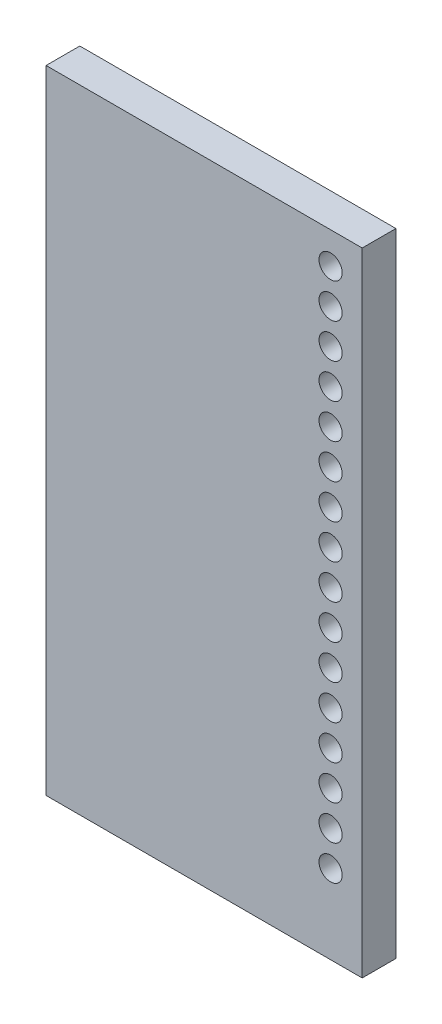
ISO-10303-21;
HEADER;
FILE_DESCRIPTION(('STEP AP214'),'2;1');
FILE_NAME('part.step','',(''),(''),'','','');
FILE_SCHEMA(('AUTOMOTIVE_DESIGN { 1 0 10303 214 1 1 1 1 }'));
ENDSEC;
DATA;
#1=APPLICATION_CONTEXT('core data for automotive mechanical design processes');
#2=APPLICATION_PROTOCOL_DEFINITION('international standard','automotive_design',2000,#1);
#3=PRODUCT_CONTEXT('',#1,'mechanical');
#4=PRODUCT('Part','Part','',(#3));
#5=PRODUCT_RELATED_PRODUCT_CATEGORY('part','',(#4));
#6=PRODUCT_DEFINITION_FORMATION('','',#4);
#7=PRODUCT_DEFINITION_CONTEXT('part definition',#1,'design');
#8=PRODUCT_DEFINITION('design','',#6,#7);
#9=PRODUCT_DEFINITION_SHAPE('','',#8);
#10=(LENGTH_UNIT() NAMED_UNIT(*) SI_UNIT(.MILLI.,.METRE.));
#11=(NAMED_UNIT(*) PLANE_ANGLE_UNIT() SI_UNIT($,.RADIAN.));
#12=(NAMED_UNIT(*) SI_UNIT($,.STERADIAN.) SOLID_ANGLE_UNIT());
#13=UNCERTAINTY_MEASURE_WITH_UNIT(LENGTH_MEASURE(1.E-05),#10,'distance_accuracy_value','');
#14=(GEOMETRIC_REPRESENTATION_CONTEXT(3) GLOBAL_UNCERTAINTY_ASSIGNED_CONTEXT((#13)) GLOBAL_UNIT_ASSIGNED_CONTEXT((#10,
#11,#12)) REPRESENTATION_CONTEXT('',''));
#15=CARTESIAN_POINT('',(0.,0.,0.));
#16=DIRECTION('',(0.,0.,1.));
#17=DIRECTION('',(1.,0.,0.));
#18=AXIS2_PLACEMENT_3D('',#15,#16,#17);
#19=CARTESIAN_POINT('',(60.,285.,0.));
#20=DIRECTION('',(0.,0.,1.));
#21=DIRECTION('',(1.,0.,0.));
#22=AXIS2_PLACEMENT_3D('',#19,#20,#21);
#23=CYLINDRICAL_SURFACE('',#22,5.5);
#24=CARTESIAN_POINT('',(60.,285.,0.));
#25=DIRECTION('',(0.,0.,1.));
#26=DIRECTION('',(1.,0.,0.));
#27=AXIS2_PLACEMENT_3D('',#24,#25,#26);
#28=CIRCLE('',#27,5.5);
#29=CARTESIAN_POINT('',(65.5,285.,0.));
#30=VERTEX_POINT('',#29);
#31=EDGE_CURVE('E60',#30,#30,#28,.T.);
#32=ORIENTED_EDGE('',*,*,#31,.F.);
#33=EDGE_LOOP('',(#32));
#34=FACE_BOUND('',#33,.T.);
#35=CARTESIAN_POINT('',(60.,285.,16.));
#36=DIRECTION('',(0.,0.,1.));
#37=DIRECTION('',(1.,0.,0.));
#38=AXIS2_PLACEMENT_3D('',#35,#36,#37);
#39=CIRCLE('',#38,5.5);
#40=CARTESIAN_POINT('',(65.5,285.,16.));
#41=VERTEX_POINT('',#40);
#42=EDGE_CURVE('E11',#41,#41,#39,.T.);
#43=ORIENTED_EDGE('',*,*,#42,.T.);
#44=EDGE_LOOP('',(#43));
#45=FACE_BOUND('',#44,.T.);
#46=ADVANCED_FACE('F51',(#34,#45),#23,.F.);
#47=CARTESIAN_POINT('',(60.,268.5,0.));
#48=DIRECTION('',(0.,0.,1.));
#49=DIRECTION('',(1.,0.,0.));
#50=AXIS2_PLACEMENT_3D('',#47,#48,#49);
#51=CYLINDRICAL_SURFACE('',#50,5.5);
#52=CARTESIAN_POINT('',(60.,268.5,0.));
#53=DIRECTION('',(0.,0.,1.));
#54=DIRECTION('',(1.,0.,0.));
#55=AXIS2_PLACEMENT_3D('',#52,#53,#54);
#56=CIRCLE('',#55,5.5);
#57=CARTESIAN_POINT('',(65.5,268.5,0.));
#58=VERTEX_POINT('',#57);
#59=EDGE_CURVE('E290',#58,#58,#56,.T.);
#60=ORIENTED_EDGE('',*,*,#59,.F.);
#61=EDGE_LOOP('',(#60));
#62=FACE_BOUND('',#61,.T.);
#63=CARTESIAN_POINT('',(60.,268.5,16.));
#64=DIRECTION('',(0.,0.,1.));
#65=DIRECTION('',(1.,0.,0.));
#66=AXIS2_PLACEMENT_3D('',#63,#64,#65);
#67=CIRCLE('',#66,5.5);
#68=CARTESIAN_POINT('',(65.5,268.5,16.));
#69=VERTEX_POINT('',#68);
#70=EDGE_CURVE('E294',#69,#69,#67,.T.);
#71=ORIENTED_EDGE('',*,*,#70,.T.);
#72=EDGE_LOOP('',(#71));
#73=FACE_BOUND('',#72,.T.);
#74=ADVANCED_FACE('F307',(#62,#73),#51,.F.);
#75=CARTESIAN_POINT('',(60.,252.,0.));
#76=DIRECTION('',(0.,0.,1.));
#77=DIRECTION('',(1.,0.,0.));
#78=AXIS2_PLACEMENT_3D('',#75,#76,#77);
#79=CYLINDRICAL_SURFACE('',#78,5.5);
#80=CARTESIAN_POINT('',(60.,252.,0.));
#81=DIRECTION('',(0.,0.,1.));
#82=DIRECTION('',(1.,0.,0.));
#83=AXIS2_PLACEMENT_3D('',#80,#81,#82);
#84=CIRCLE('',#83,5.5);
#85=CARTESIAN_POINT('',(65.5,252.,0.));
#86=VERTEX_POINT('',#85);
#87=EDGE_CURVE('E282',#86,#86,#84,.T.);
#88=ORIENTED_EDGE('',*,*,#87,.F.);
#89=EDGE_LOOP('',(#88));
#90=FACE_BOUND('',#89,.T.);
#91=CARTESIAN_POINT('',(60.,252.,16.));
#92=DIRECTION('',(0.,0.,1.));
#93=DIRECTION('',(1.,0.,0.));
#94=AXIS2_PLACEMENT_3D('',#91,#92,#93);
#95=CIRCLE('',#94,5.5);
#96=CARTESIAN_POINT('',(65.5,252.,16.));
#97=VERTEX_POINT('',#96);
#98=EDGE_CURVE('E286',#97,#97,#95,.T.);
#99=ORIENTED_EDGE('',*,*,#98,.T.);
#100=EDGE_LOOP('',(#99));
#101=FACE_BOUND('',#100,.T.);
#102=ADVANCED_FACE('F382',(#90,#101),#79,.F.);
#103=CARTESIAN_POINT('',(60.,235.5,0.));
#104=DIRECTION('',(0.,0.,1.));
#105=DIRECTION('',(1.,0.,0.));
#106=AXIS2_PLACEMENT_3D('',#103,#104,#105);
#107=CYLINDRICAL_SURFACE('',#106,5.5);
#108=CARTESIAN_POINT('',(60.,235.5,0.));
#109=DIRECTION('',(0.,0.,1.));
#110=DIRECTION('',(1.,0.,0.));
#111=AXIS2_PLACEMENT_3D('',#108,#109,#110);
#112=CIRCLE('',#111,5.5);
#113=CARTESIAN_POINT('',(65.5,235.5,0.));
#114=VERTEX_POINT('',#113);
#115=EDGE_CURVE('E274',#114,#114,#112,.T.);
#116=ORIENTED_EDGE('',*,*,#115,.F.);
#117=EDGE_LOOP('',(#116));
#118=FACE_BOUND('',#117,.T.);
#119=CARTESIAN_POINT('',(60.,235.5,16.));
#120=DIRECTION('',(0.,0.,1.));
#121=DIRECTION('',(1.,0.,0.));
#122=AXIS2_PLACEMENT_3D('',#119,#120,#121);
#123=CIRCLE('',#122,5.5);
#124=CARTESIAN_POINT('',(65.5,235.5,16.));
#125=VERTEX_POINT('',#124);
#126=EDGE_CURVE('E278',#125,#125,#123,.T.);
#127=ORIENTED_EDGE('',*,*,#126,.T.);
#128=EDGE_LOOP('',(#127));
#129=FACE_BOUND('',#128,.T.);
#130=ADVANCED_FACE('F378',(#118,#129),#107,.F.);
#131=CARTESIAN_POINT('',(60.,219.,0.));
#132=DIRECTION('',(0.,0.,1.));
#133=DIRECTION('',(1.,0.,0.));
#134=AXIS2_PLACEMENT_3D('',#131,#132,#133);
#135=CYLINDRICAL_SURFACE('',#134,5.5);
#136=CARTESIAN_POINT('',(60.,219.,0.));
#137=DIRECTION('',(0.,0.,1.));
#138=DIRECTION('',(1.,0.,0.));
#139=AXIS2_PLACEMENT_3D('',#136,#137,#138);
#140=CIRCLE('',#139,5.5);
#141=CARTESIAN_POINT('',(65.5,219.,0.));
#142=VERTEX_POINT('',#141);
#143=EDGE_CURVE('E266',#142,#142,#140,.T.);
#144=ORIENTED_EDGE('',*,*,#143,.F.);
#145=EDGE_LOOP('',(#144));
#146=FACE_BOUND('',#145,.T.);
#147=CARTESIAN_POINT('',(60.,219.,16.));
#148=DIRECTION('',(0.,0.,1.));
#149=DIRECTION('',(1.,0.,0.));
#150=AXIS2_PLACEMENT_3D('',#147,#148,#149);
#151=CIRCLE('',#150,5.5);
#152=CARTESIAN_POINT('',(65.5,219.,16.));
#153=VERTEX_POINT('',#152);
#154=EDGE_CURVE('E270',#153,#153,#151,.T.);
#155=ORIENTED_EDGE('',*,*,#154,.T.);
#156=EDGE_LOOP('',(#155));
#157=FACE_BOUND('',#156,.T.);
#158=ADVANCED_FACE('F374',(#146,#157),#135,.F.);
#159=CARTESIAN_POINT('',(60.,202.5,0.));
#160=DIRECTION('',(0.,0.,1.));
#161=DIRECTION('',(1.,0.,0.));
#162=AXIS2_PLACEMENT_3D('',#159,#160,#161);
#163=CYLINDRICAL_SURFACE('',#162,5.5);
#164=CARTESIAN_POINT('',(60.,202.5,0.));
#165=DIRECTION('',(0.,0.,1.));
#166=DIRECTION('',(1.,0.,0.));
#167=AXIS2_PLACEMENT_3D('',#164,#165,#166);
#168=CIRCLE('',#167,5.5);
#169=CARTESIAN_POINT('',(65.5,202.5,0.));
#170=VERTEX_POINT('',#169);
#171=EDGE_CURVE('E258',#170,#170,#168,.T.);
#172=ORIENTED_EDGE('',*,*,#171,.F.);
#173=EDGE_LOOP('',(#172));
#174=FACE_BOUND('',#173,.T.);
#175=CARTESIAN_POINT('',(60.,202.5,16.));
#176=DIRECTION('',(0.,0.,1.));
#177=DIRECTION('',(1.,0.,0.));
#178=AXIS2_PLACEMENT_3D('',#175,#176,#177);
#179=CIRCLE('',#178,5.5);
#180=CARTESIAN_POINT('',(65.5,202.5,16.));
#181=VERTEX_POINT('',#180);
#182=EDGE_CURVE('E262',#181,#181,#179,.T.);
#183=ORIENTED_EDGE('',*,*,#182,.T.);
#184=EDGE_LOOP('',(#183));
#185=FACE_BOUND('',#184,.T.);
#186=ADVANCED_FACE('F370',(#174,#185),#163,.F.);
#187=CARTESIAN_POINT('',(60.,186.,0.));
#188=DIRECTION('',(0.,0.,1.));
#189=DIRECTION('',(1.,0.,0.));
#190=AXIS2_PLACEMENT_3D('',#187,#188,#189);
#191=CYLINDRICAL_SURFACE('',#190,5.5);
#192=CARTESIAN_POINT('',(60.,186.,0.));
#193=DIRECTION('',(0.,0.,1.));
#194=DIRECTION('',(1.,0.,0.));
#195=AXIS2_PLACEMENT_3D('',#192,#193,#194);
#196=CIRCLE('',#195,5.5);
#197=CARTESIAN_POINT('',(65.5,186.,0.));
#198=VERTEX_POINT('',#197);
#199=EDGE_CURVE('E250',#198,#198,#196,.T.);
#200=ORIENTED_EDGE('',*,*,#199,.F.);
#201=EDGE_LOOP('',(#200));
#202=FACE_BOUND('',#201,.T.);
#203=CARTESIAN_POINT('',(60.,186.,16.));
#204=DIRECTION('',(0.,0.,1.));
#205=DIRECTION('',(1.,0.,0.));
#206=AXIS2_PLACEMENT_3D('',#203,#204,#205);
#207=CIRCLE('',#206,5.5);
#208=CARTESIAN_POINT('',(65.5,186.,16.));
#209=VERTEX_POINT('',#208);
#210=EDGE_CURVE('E254',#209,#209,#207,.T.);
#211=ORIENTED_EDGE('',*,*,#210,.T.);
#212=EDGE_LOOP('',(#211));
#213=FACE_BOUND('',#212,.T.);
#214=ADVANCED_FACE('F366',(#202,#213),#191,.F.);
#215=CARTESIAN_POINT('',(60.,169.5,0.));
#216=DIRECTION('',(0.,0.,1.));
#217=DIRECTION('',(1.,0.,0.));
#218=AXIS2_PLACEMENT_3D('',#215,#216,#217);
#219=CYLINDRICAL_SURFACE('',#218,5.5);
#220=CARTESIAN_POINT('',(60.,169.5,0.));
#221=DIRECTION('',(0.,0.,1.));
#222=DIRECTION('',(1.,0.,0.));
#223=AXIS2_PLACEMENT_3D('',#220,#221,#222);
#224=CIRCLE('',#223,5.5);
#225=CARTESIAN_POINT('',(65.5,169.5,0.));
#226=VERTEX_POINT('',#225);
#227=EDGE_CURVE('E242',#226,#226,#224,.T.);
#228=ORIENTED_EDGE('',*,*,#227,.F.);
#229=EDGE_LOOP('',(#228));
#230=FACE_BOUND('',#229,.T.);
#231=CARTESIAN_POINT('',(60.,169.5,16.));
#232=DIRECTION('',(0.,0.,1.));
#233=DIRECTION('',(1.,0.,0.));
#234=AXIS2_PLACEMENT_3D('',#231,#232,#233);
#235=CIRCLE('',#234,5.5);
#236=CARTESIAN_POINT('',(65.5,169.5,16.));
#237=VERTEX_POINT('',#236);
#238=EDGE_CURVE('E246',#237,#237,#235,.T.);
#239=ORIENTED_EDGE('',*,*,#238,.T.);
#240=EDGE_LOOP('',(#239));
#241=FACE_BOUND('',#240,.T.);
#242=ADVANCED_FACE('F362',(#230,#241),#219,.F.);
#243=CARTESIAN_POINT('',(60.,153.,0.));
#244=DIRECTION('',(0.,0.,1.));
#245=DIRECTION('',(1.,0.,0.));
#246=AXIS2_PLACEMENT_3D('',#243,#244,#245);
#247=CYLINDRICAL_SURFACE('',#246,5.5);
#248=CARTESIAN_POINT('',(60.,153.,0.));
#249=DIRECTION('',(0.,0.,1.));
#250=DIRECTION('',(1.,0.,0.));
#251=AXIS2_PLACEMENT_3D('',#248,#249,#250);
#252=CIRCLE('',#251,5.5);
#253=CARTESIAN_POINT('',(65.5,153.,0.));
#254=VERTEX_POINT('',#253);
#255=EDGE_CURVE('E234',#254,#254,#252,.T.);
#256=ORIENTED_EDGE('',*,*,#255,.F.);
#257=EDGE_LOOP('',(#256));
#258=FACE_BOUND('',#257,.T.);
#259=CARTESIAN_POINT('',(60.,153.,16.));
#260=DIRECTION('',(0.,0.,1.));
#261=DIRECTION('',(1.,0.,0.));
#262=AXIS2_PLACEMENT_3D('',#259,#260,#261);
#263=CIRCLE('',#262,5.5);
#264=CARTESIAN_POINT('',(65.5,153.,16.));
#265=VERTEX_POINT('',#264);
#266=EDGE_CURVE('E238',#265,#265,#263,.T.);
#267=ORIENTED_EDGE('',*,*,#266,.T.);
#268=EDGE_LOOP('',(#267));
#269=FACE_BOUND('',#268,.T.);
#270=ADVANCED_FACE('F358',(#258,#269),#247,.F.);
#271=CARTESIAN_POINT('',(60.,136.5,0.));
#272=DIRECTION('',(0.,0.,1.));
#273=DIRECTION('',(1.,0.,0.));
#274=AXIS2_PLACEMENT_3D('',#271,#272,#273);
#275=CYLINDRICAL_SURFACE('',#274,5.5);
#276=CARTESIAN_POINT('',(60.,136.5,0.));
#277=DIRECTION('',(0.,0.,1.));
#278=DIRECTION('',(1.,0.,0.));
#279=AXIS2_PLACEMENT_3D('',#276,#277,#278);
#280=CIRCLE('',#279,5.5);
#281=CARTESIAN_POINT('',(65.5,136.5,0.));
#282=VERTEX_POINT('',#281);
#283=EDGE_CURVE('E226',#282,#282,#280,.T.);
#284=ORIENTED_EDGE('',*,*,#283,.F.);
#285=EDGE_LOOP('',(#284));
#286=FACE_BOUND('',#285,.T.);
#287=CARTESIAN_POINT('',(60.,136.5,16.));
#288=DIRECTION('',(0.,0.,1.));
#289=DIRECTION('',(1.,0.,0.));
#290=AXIS2_PLACEMENT_3D('',#287,#288,#289);
#291=CIRCLE('',#290,5.5);
#292=CARTESIAN_POINT('',(65.5,136.5,16.));
#293=VERTEX_POINT('',#292);
#294=EDGE_CURVE('E230',#293,#293,#291,.T.);
#295=ORIENTED_EDGE('',*,*,#294,.T.);
#296=EDGE_LOOP('',(#295));
#297=FACE_BOUND('',#296,.T.);
#298=ADVANCED_FACE('F354',(#286,#297),#275,.F.);
#299=CARTESIAN_POINT('',(60.,120.,0.));
#300=DIRECTION('',(0.,0.,1.));
#301=DIRECTION('',(1.,0.,0.));
#302=AXIS2_PLACEMENT_3D('',#299,#300,#301);
#303=CYLINDRICAL_SURFACE('',#302,5.5);
#304=CARTESIAN_POINT('',(60.,120.,0.));
#305=DIRECTION('',(0.,0.,1.));
#306=DIRECTION('',(1.,0.,0.));
#307=AXIS2_PLACEMENT_3D('',#304,#305,#306);
#308=CIRCLE('',#307,5.5);
#309=CARTESIAN_POINT('',(65.5,120.,0.));
#310=VERTEX_POINT('',#309);
#311=EDGE_CURVE('E218',#310,#310,#308,.T.);
#312=ORIENTED_EDGE('',*,*,#311,.F.);
#313=EDGE_LOOP('',(#312));
#314=FACE_BOUND('',#313,.T.);
#315=CARTESIAN_POINT('',(60.,120.,16.));
#316=DIRECTION('',(0.,0.,1.));
#317=DIRECTION('',(1.,0.,0.));
#318=AXIS2_PLACEMENT_3D('',#315,#316,#317);
#319=CIRCLE('',#318,5.5);
#320=CARTESIAN_POINT('',(65.5,120.,16.));
#321=VERTEX_POINT('',#320);
#322=EDGE_CURVE('E222',#321,#321,#319,.T.);
#323=ORIENTED_EDGE('',*,*,#322,.T.);
#324=EDGE_LOOP('',(#323));
#325=FACE_BOUND('',#324,.T.);
#326=ADVANCED_FACE('F350',(#314,#325),#303,.F.);
#327=CARTESIAN_POINT('',(60.,103.5,0.));
#328=DIRECTION('',(0.,0.,1.));
#329=DIRECTION('',(1.,0.,0.));
#330=AXIS2_PLACEMENT_3D('',#327,#328,#329);
#331=CYLINDRICAL_SURFACE('',#330,5.5);
#332=CARTESIAN_POINT('',(60.,103.5,0.));
#333=DIRECTION('',(0.,0.,1.));
#334=DIRECTION('',(1.,0.,0.));
#335=AXIS2_PLACEMENT_3D('',#332,#333,#334);
#336=CIRCLE('',#335,5.5);
#337=CARTESIAN_POINT('',(65.5,103.5,0.));
#338=VERTEX_POINT('',#337);
#339=EDGE_CURVE('E210',#338,#338,#336,.T.);
#340=ORIENTED_EDGE('',*,*,#339,.F.);
#341=EDGE_LOOP('',(#340));
#342=FACE_BOUND('',#341,.T.);
#343=CARTESIAN_POINT('',(60.,103.5,16.));
#344=DIRECTION('',(0.,0.,1.));
#345=DIRECTION('',(1.,0.,0.));
#346=AXIS2_PLACEMENT_3D('',#343,#344,#345);
#347=CIRCLE('',#346,5.5);
#348=CARTESIAN_POINT('',(65.5,103.5,16.));
#349=VERTEX_POINT('',#348);
#350=EDGE_CURVE('E214',#349,#349,#347,.T.);
#351=ORIENTED_EDGE('',*,*,#350,.T.);
#352=EDGE_LOOP('',(#351));
#353=FACE_BOUND('',#352,.T.);
#354=ADVANCED_FACE('F346',(#342,#353),#331,.F.);
#355=CARTESIAN_POINT('',(60.,87.,0.));
#356=DIRECTION('',(0.,0.,1.));
#357=DIRECTION('',(1.,0.,0.));
#358=AXIS2_PLACEMENT_3D('',#355,#356,#357);
#359=CYLINDRICAL_SURFACE('',#358,5.5);
#360=CARTESIAN_POINT('',(60.,87.,0.));
#361=DIRECTION('',(0.,0.,1.));
#362=DIRECTION('',(1.,0.,0.));
#363=AXIS2_PLACEMENT_3D('',#360,#361,#362);
#364=CIRCLE('',#363,5.5);
#365=CARTESIAN_POINT('',(65.5,87.,0.));
#366=VERTEX_POINT('',#365);
#367=EDGE_CURVE('E202',#366,#366,#364,.T.);
#368=ORIENTED_EDGE('',*,*,#367,.F.);
#369=EDGE_LOOP('',(#368));
#370=FACE_BOUND('',#369,.T.);
#371=CARTESIAN_POINT('',(60.,87.,16.));
#372=DIRECTION('',(0.,0.,1.));
#373=DIRECTION('',(1.,0.,0.));
#374=AXIS2_PLACEMENT_3D('',#371,#372,#373);
#375=CIRCLE('',#374,5.5);
#376=CARTESIAN_POINT('',(65.5,87.,16.));
#377=VERTEX_POINT('',#376);
#378=EDGE_CURVE('E206',#377,#377,#375,.T.);
#379=ORIENTED_EDGE('',*,*,#378,.T.);
#380=EDGE_LOOP('',(#379));
#381=FACE_BOUND('',#380,.T.);
#382=ADVANCED_FACE('F342',(#370,#381),#359,.F.);
#383=CARTESIAN_POINT('',(60.,70.5,0.));
#384=DIRECTION('',(0.,0.,1.));
#385=DIRECTION('',(1.,0.,0.));
#386=AXIS2_PLACEMENT_3D('',#383,#384,#385);
#387=CYLINDRICAL_SURFACE('',#386,5.5);
#388=CARTESIAN_POINT('',(60.,70.5,0.));
#389=DIRECTION('',(0.,0.,1.));
#390=DIRECTION('',(1.,0.,0.));
#391=AXIS2_PLACEMENT_3D('',#388,#389,#390);
#392=CIRCLE('',#391,5.5);
#393=CARTESIAN_POINT('',(65.5,70.5,0.));
#394=VERTEX_POINT('',#393);
#395=EDGE_CURVE('E194',#394,#394,#392,.T.);
#396=ORIENTED_EDGE('',*,*,#395,.F.);
#397=EDGE_LOOP('',(#396));
#398=FACE_BOUND('',#397,.T.);
#399=CARTESIAN_POINT('',(60.,70.5,16.));
#400=DIRECTION('',(0.,0.,1.));
#401=DIRECTION('',(1.,0.,0.));
#402=AXIS2_PLACEMENT_3D('',#399,#400,#401);
#403=CIRCLE('',#402,5.5);
#404=CARTESIAN_POINT('',(65.5,70.5,16.));
#405=VERTEX_POINT('',#404);
#406=EDGE_CURVE('E198',#405,#405,#403,.T.);
#407=ORIENTED_EDGE('',*,*,#406,.T.);
#408=EDGE_LOOP('',(#407));
#409=FACE_BOUND('',#408,.T.);
#410=ADVANCED_FACE('F339',(#398,#409),#387,.F.);
#411=CARTESIAN_POINT('',(-75.,0.,16.));
#412=DIRECTION('',(1.,0.,0.));
#413=DIRECTION('',(0.,1.,0.));
#414=AXIS2_PLACEMENT_3D('',#411,#412,#413);
#415=PLANE('',#414);
#416=DIRECTION('',(0.,-1.,0.));
#417=VECTOR('',#416,1.);
#418=CARTESIAN_POINT('',(-75.,0.,0.));
#419=LINE('',#418,#417);
#420=CARTESIAN_POINT('',(-75.0000000000001,300.,0.));
#421=VERTEX_POINT('',#420);
#422=CARTESIAN_POINT('',(-75.,0.,0.));
#423=VERTEX_POINT('',#422);
#424=EDGE_CURVE('E158',#421,#423,#419,.T.);
#425=ORIENTED_EDGE('',*,*,#424,.T.);
#426=DIRECTION('',(0.,0.,-1.));
#427=VECTOR('',#426,1.);
#428=CARTESIAN_POINT('',(-75.,0.,16.));
#429=LINE('',#428,#427);
#430=CARTESIAN_POINT('',(-75.,0.,16.));
#431=VERTEX_POINT('',#430);
#432=EDGE_CURVE('E191',#431,#423,#429,.T.);
#433=ORIENTED_EDGE('',*,*,#432,.F.);
#434=DIRECTION('',(0.,-1.,0.));
#435=VECTOR('',#434,1.);
#436=CARTESIAN_POINT('',(-75.,0.,16.));
#437=LINE('',#436,#435);
#438=CARTESIAN_POINT('',(-75.0000000000001,300.,16.));
#439=VERTEX_POINT('',#438);
#440=EDGE_CURVE('E162',#439,#431,#437,.T.);
#441=ORIENTED_EDGE('',*,*,#440,.F.);
#442=DIRECTION('',(0.,0.,-1.));
#443=VECTOR('',#442,1.);
#444=CARTESIAN_POINT('',(-75.0000000000001,300.,16.));
#445=LINE('',#444,#443);
#446=EDGE_CURVE('E172',#439,#421,#445,.T.);
#447=ORIENTED_EDGE('',*,*,#446,.T.);
#448=EDGE_LOOP('',(#425,#433,#441,#447));
#449=FACE_BOUND('',#448,.T.);
#450=ADVANCED_FACE('F335',(#449),#415,.F.);
#451=CARTESIAN_POINT('',(-75.,0.,16.));
#452=DIRECTION('',(0.,1.,0.));
#453=DIRECTION('',(-1.,0.,0.));
#454=AXIS2_PLACEMENT_3D('',#451,#452,#453);
#455=PLANE('',#454);
#456=CARTESIAN_POINT('',(60.,0.,8.));
#457=DIRECTION('',(0.,-1.,0.));
#458=DIRECTION('',(0.,0.,-1.));
#459=AXIS2_PLACEMENT_3D('',#456,#457,#458);
#460=CIRCLE('',#459,1.7272);
#461=CARTESIAN_POINT('',(60.,0.,6.2728));
#462=VERTEX_POINT('',#461);
#463=EDGE_CURVE('E122',#462,#462,#460,.T.);
#464=ORIENTED_EDGE('',*,*,#463,.F.);
#465=EDGE_LOOP('',(#464));
#466=FACE_BOUND('',#465,.T.);
#467=CARTESIAN_POINT('',(0.,0.,8.));
#468=DIRECTION('',(0.,-1.,0.));
#469=DIRECTION('',(0.,0.,-1.));
#470=AXIS2_PLACEMENT_3D('',#467,#468,#469);
#471=CIRCLE('',#470,1.7272);
#472=CARTESIAN_POINT('',(0.,0.,6.2728));
#473=VERTEX_POINT('',#472);
#474=EDGE_CURVE('E121',#473,#473,#471,.T.);
#475=ORIENTED_EDGE('',*,*,#474,.F.);
#476=EDGE_LOOP('',(#475));
#477=FACE_BOUND('',#476,.T.);
#478=CARTESIAN_POINT('',(-60.,0.,8.));
#479=DIRECTION('',(0.,-1.,0.));
#480=DIRECTION('',(0.,0.,-1.));
#481=AXIS2_PLACEMENT_3D('',#478,#479,#480);
#482=CIRCLE('',#481,1.7272);
#483=CARTESIAN_POINT('',(-60.,0.,6.2728));
#484=VERTEX_POINT('',#483);
#485=EDGE_CURVE('E137',#484,#484,#482,.T.);
#486=ORIENTED_EDGE('',*,*,#485,.F.);
#487=EDGE_LOOP('',(#486));
#488=FACE_BOUND('',#487,.T.);
#489=DIRECTION('',(1.,0.,0.));
#490=VECTOR('',#489,1.);
#491=CARTESIAN_POINT('',(-75.,0.,0.));
#492=LINE('',#491,#490);
#493=CARTESIAN_POINT('',(75.,0.,0.));
#494=VERTEX_POINT('',#493);
#495=EDGE_CURVE('E176',#423,#494,#492,.T.);
#496=ORIENTED_EDGE('',*,*,#495,.T.);
#497=DIRECTION('',(0.,0.,-1.));
#498=VECTOR('',#497,1.);
#499=CARTESIAN_POINT('',(75.,0.,16.));
#500=LINE('',#499,#498);
#501=CARTESIAN_POINT('',(75.,0.,16.));
#502=VERTEX_POINT('',#501);
#503=EDGE_CURVE('E188',#502,#494,#500,.T.);
#504=ORIENTED_EDGE('',*,*,#503,.F.);
#505=DIRECTION('',(1.,0.,0.));
#506=VECTOR('',#505,1.);
#507=CARTESIAN_POINT('',(-75.,0.,16.));
#508=LINE('',#507,#506);
#509=EDGE_CURVE('E100',#431,#502,#508,.T.);
#510=ORIENTED_EDGE('',*,*,#509,.F.);
#511=ORIENTED_EDGE('',*,*,#432,.T.);
#512=EDGE_LOOP('',(#496,#504,#510,#511));
#513=FACE_BOUND('',#512,.T.);
#514=ADVANCED_FACE('F332',(#466,#477,#488,#513),#455,.F.);
#515=CARTESIAN_POINT('',(75.,0.,16.));
#516=DIRECTION('',(-1.,0.,0.));
#517=DIRECTION('',(0.,-1.,0.));
#518=AXIS2_PLACEMENT_3D('',#515,#516,#517);
#519=PLANE('',#518);
#520=DIRECTION('',(0.,1.,0.));
#521=VECTOR('',#520,1.);
#522=CARTESIAN_POINT('',(75.,0.,0.));
#523=LINE('',#522,#521);
#524=CARTESIAN_POINT('',(75.,300.,0.));
#525=VERTEX_POINT('',#524);
#526=EDGE_CURVE('E86',#494,#525,#523,.T.);
#527=ORIENTED_EDGE('',*,*,#526,.T.);
#528=DIRECTION('',(0.,0.,-1.));
#529=VECTOR('',#528,1.);
#530=CARTESIAN_POINT('',(75.,300.,16.));
#531=LINE('',#530,#529);
#532=CARTESIAN_POINT('',(75.,300.,16.));
#533=VERTEX_POINT('',#532);
#534=EDGE_CURVE('E185',#533,#525,#531,.T.);
#535=ORIENTED_EDGE('',*,*,#534,.F.);
#536=DIRECTION('',(0.,1.,0.));
#537=VECTOR('',#536,1.);
#538=CARTESIAN_POINT('',(75.,0.,16.));
#539=LINE('',#538,#537);
#540=EDGE_CURVE('E167',#502,#533,#539,.T.);
#541=ORIENTED_EDGE('',*,*,#540,.F.);
#542=ORIENTED_EDGE('',*,*,#503,.T.);
#543=EDGE_LOOP('',(#527,#535,#541,#542));
#544=FACE_BOUND('',#543,.T.);
#545=ADVANCED_FACE('F323',(#544),#519,.F.);
#546=CARTESIAN_POINT('',(-75.0000000000001,300.,16.));
#547=DIRECTION('',(0.,-1.,0.));
#548=DIRECTION('',(0.,0.,-1.));
#549=AXIS2_PLACEMENT_3D('',#546,#547,#548);
#550=PLANE('',#549);
#551=DIRECTION('',(-1.,0.,0.));
#552=VECTOR('',#551,1.);
#553=CARTESIAN_POINT('',(-75.0000000000001,300.,0.));
#554=LINE('',#553,#552);
#555=EDGE_CURVE('E92',#525,#421,#554,.T.);
#556=ORIENTED_EDGE('',*,*,#555,.T.);
#557=ORIENTED_EDGE('',*,*,#446,.F.);
#558=DIRECTION('',(-1.,0.,0.));
#559=VECTOR('',#558,1.);
#560=CARTESIAN_POINT('',(-75.0000000000001,300.,16.));
#561=LINE('',#560,#559);
#562=EDGE_CURVE('E68',#533,#439,#561,.T.);
#563=ORIENTED_EDGE('',*,*,#562,.F.);
#564=ORIENTED_EDGE('',*,*,#534,.T.);
#565=EDGE_LOOP('',(#556,#557,#563,#564));
#566=FACE_BOUND('',#565,.T.);
#567=ADVANCED_FACE('F312',(#566),#550,.F.);
#568=CARTESIAN_POINT('',(0.,0.,16.));
#569=DIRECTION('',(0.,0.,-1.));
#570=DIRECTION('',(-1.,0.,0.));
#571=AXIS2_PLACEMENT_3D('',#568,#569,#570);
#572=PLANE('',#571);
#573=CARTESIAN_POINT('',(60.,54.,16.));
#574=DIRECTION('',(0.,0.,1.));
#575=DIRECTION('',(1.,0.,0.));
#576=AXIS2_PLACEMENT_3D('',#573,#574,#575);
#577=CIRCLE('',#576,5.5);
#578=CARTESIAN_POINT('',(65.5,54.,16.));
#579=VERTEX_POINT('',#578);
#580=EDGE_CURVE('E149',#579,#579,#577,.T.);
#581=ORIENTED_EDGE('',*,*,#580,.F.);
#582=EDGE_LOOP('',(#581));
#583=FACE_BOUND('',#582,.T.);
#584=CARTESIAN_POINT('',(60.,37.5,16.));
#585=DIRECTION('',(0.,0.,1.));
#586=DIRECTION('',(1.,0.,0.));
#587=AXIS2_PLACEMENT_3D('',#584,#585,#586);
#588=CIRCLE('',#587,5.5);
#589=CARTESIAN_POINT('',(65.5,37.5,16.));
#590=VERTEX_POINT('',#589);
#591=EDGE_CURVE('E153',#590,#590,#588,.T.);
#592=ORIENTED_EDGE('',*,*,#591,.F.);
#593=EDGE_LOOP('',(#592));
#594=FACE_BOUND('',#593,.T.);
#595=ORIENTED_EDGE('',*,*,#440,.T.);
#596=ORIENTED_EDGE('',*,*,#509,.T.);
#597=ORIENTED_EDGE('',*,*,#540,.T.);
#598=ORIENTED_EDGE('',*,*,#562,.T.);
#599=EDGE_LOOP('',(#595,#596,#597,#598));
#600=FACE_BOUND('',#599,.T.);
#601=ORIENTED_EDGE('',*,*,#406,.F.);
#602=EDGE_LOOP('',(#601));
#603=FACE_BOUND('',#602,.T.);
#604=ORIENTED_EDGE('',*,*,#378,.F.);
#605=EDGE_LOOP('',(#604));
#606=FACE_BOUND('',#605,.T.);
#607=ORIENTED_EDGE('',*,*,#350,.F.);
#608=EDGE_LOOP('',(#607));
#609=FACE_BOUND('',#608,.T.);
#610=ORIENTED_EDGE('',*,*,#322,.F.);
#611=EDGE_LOOP('',(#610));
#612=FACE_BOUND('',#611,.T.);
#613=ORIENTED_EDGE('',*,*,#294,.F.);
#614=EDGE_LOOP('',(#613));
#615=FACE_BOUND('',#614,.T.);
#616=ORIENTED_EDGE('',*,*,#266,.F.);
#617=EDGE_LOOP('',(#616));
#618=FACE_BOUND('',#617,.T.);
#619=ORIENTED_EDGE('',*,*,#238,.F.);
#620=EDGE_LOOP('',(#619));
#621=FACE_BOUND('',#620,.T.);
#622=ORIENTED_EDGE('',*,*,#210,.F.);
#623=EDGE_LOOP('',(#622));
#624=FACE_BOUND('',#623,.T.);
#625=ORIENTED_EDGE('',*,*,#182,.F.);
#626=EDGE_LOOP('',(#625));
#627=FACE_BOUND('',#626,.T.);
#628=ORIENTED_EDGE('',*,*,#154,.F.);
#629=EDGE_LOOP('',(#628));
#630=FACE_BOUND('',#629,.T.);
#631=ORIENTED_EDGE('',*,*,#126,.F.);
#632=EDGE_LOOP('',(#631));
#633=FACE_BOUND('',#632,.T.);
#634=ORIENTED_EDGE('',*,*,#98,.F.);
#635=EDGE_LOOP('',(#634));
#636=FACE_BOUND('',#635,.T.);
#637=ORIENTED_EDGE('',*,*,#70,.F.);
#638=EDGE_LOOP('',(#637));
#639=FACE_BOUND('',#638,.T.);
#640=ORIENTED_EDGE('',*,*,#42,.F.);
#641=EDGE_LOOP('',(#640));
#642=FACE_BOUND('',#641,.T.);
#643=ADVANCED_FACE('F310',(#583,#594,#600,#603,#606,#609,#612,#615,#618,#621,#624,#627,#630,
#633,#636,#639,#642),#572,.F.);
#644=CARTESIAN_POINT('',(0.,0.,0.));
#645=DIRECTION('',(0.,0.,-1.));
#646=DIRECTION('',(-1.,0.,0.));
#647=AXIS2_PLACEMENT_3D('',#644,#645,#646);
#648=PLANE('',#647);
#649=CARTESIAN_POINT('',(60.,54.,0.));
#650=DIRECTION('',(0.,0.,1.));
#651=DIRECTION('',(1.,0.,0.));
#652=AXIS2_PLACEMENT_3D('',#649,#650,#651);
#653=CIRCLE('',#652,5.5);
#654=CARTESIAN_POINT('',(65.5,54.,0.));
#655=VERTEX_POINT('',#654);
#656=EDGE_CURVE('E145',#655,#655,#653,.T.);
#657=ORIENTED_EDGE('',*,*,#656,.T.);
#658=EDGE_LOOP('',(#657));
#659=FACE_BOUND('',#658,.T.);
#660=CARTESIAN_POINT('',(60.,37.5,0.));
#661=DIRECTION('',(0.,0.,1.));
#662=DIRECTION('',(1.,0.,0.));
#663=AXIS2_PLACEMENT_3D('',#660,#661,#662);
#664=CIRCLE('',#663,5.5);
#665=CARTESIAN_POINT('',(65.5,37.5,0.));
#666=VERTEX_POINT('',#665);
#667=EDGE_CURVE('E154',#666,#666,#664,.T.);
#668=ORIENTED_EDGE('',*,*,#667,.T.);
#669=EDGE_LOOP('',(#668));
#670=FACE_BOUND('',#669,.T.);
#671=ORIENTED_EDGE('',*,*,#424,.F.);
#672=ORIENTED_EDGE('',*,*,#555,.F.);
#673=ORIENTED_EDGE('',*,*,#526,.F.);
#674=ORIENTED_EDGE('',*,*,#495,.F.);
#675=EDGE_LOOP('',(#671,#672,#673,#674));
#676=FACE_BOUND('',#675,.T.);
#677=ORIENTED_EDGE('',*,*,#395,.T.);
#678=EDGE_LOOP('',(#677));
#679=FACE_BOUND('',#678,.T.);
#680=ORIENTED_EDGE('',*,*,#367,.T.);
#681=EDGE_LOOP('',(#680));
#682=FACE_BOUND('',#681,.T.);
#683=ORIENTED_EDGE('',*,*,#339,.T.);
#684=EDGE_LOOP('',(#683));
#685=FACE_BOUND('',#684,.T.);
#686=ORIENTED_EDGE('',*,*,#311,.T.);
#687=EDGE_LOOP('',(#686));
#688=FACE_BOUND('',#687,.T.);
#689=ORIENTED_EDGE('',*,*,#283,.T.);
#690=EDGE_LOOP('',(#689));
#691=FACE_BOUND('',#690,.T.);
#692=ORIENTED_EDGE('',*,*,#255,.T.);
#693=EDGE_LOOP('',(#692));
#694=FACE_BOUND('',#693,.T.);
#695=ORIENTED_EDGE('',*,*,#227,.T.);
#696=EDGE_LOOP('',(#695));
#697=FACE_BOUND('',#696,.T.);
#698=ORIENTED_EDGE('',*,*,#199,.T.);
#699=EDGE_LOOP('',(#698));
#700=FACE_BOUND('',#699,.T.);
#701=ORIENTED_EDGE('',*,*,#171,.T.);
#702=EDGE_LOOP('',(#701));
#703=FACE_BOUND('',#702,.T.);
#704=ORIENTED_EDGE('',*,*,#143,.T.);
#705=EDGE_LOOP('',(#704));
#706=FACE_BOUND('',#705,.T.);
#707=ORIENTED_EDGE('',*,*,#115,.T.);
#708=EDGE_LOOP('',(#707));
#709=FACE_BOUND('',#708,.T.);
#710=ORIENTED_EDGE('',*,*,#87,.T.);
#711=EDGE_LOOP('',(#710));
#712=FACE_BOUND('',#711,.T.);
#713=ORIENTED_EDGE('',*,*,#59,.T.);
#714=EDGE_LOOP('',(#713));
#715=FACE_BOUND('',#714,.T.);
#716=ORIENTED_EDGE('',*,*,#31,.T.);
#717=EDGE_LOOP('',(#716));
#718=FACE_BOUND('',#717,.T.);
#719=ADVANCED_FACE('F303',(#659,#670,#676,#679,#682,#685,#688,#691,#694,#697,#700,#703,#706,
#709,#712,#715,#718),#648,.T.);
#720=CARTESIAN_POINT('',(60.,37.5,0.));
#721=DIRECTION('',(0.,0.,1.));
#722=DIRECTION('',(1.,0.,0.));
#723=AXIS2_PLACEMENT_3D('',#720,#721,#722);
#724=CYLINDRICAL_SURFACE('',#723,5.5);
#725=ORIENTED_EDGE('',*,*,#667,.F.);
#726=EDGE_LOOP('',(#725));
#727=FACE_BOUND('',#726,.T.);
#728=ORIENTED_EDGE('',*,*,#591,.T.);
#729=EDGE_LOOP('',(#728));
#730=FACE_BOUND('',#729,.T.);
#731=ADVANCED_FACE('F319',(#727,#730),#724,.F.);
#732=CARTESIAN_POINT('',(60.,54.,0.));
#733=DIRECTION('',(0.,0.,1.));
#734=DIRECTION('',(1.,0.,0.));
#735=AXIS2_PLACEMENT_3D('',#732,#733,#734);
#736=CYLINDRICAL_SURFACE('',#735,5.5);
#737=ORIENTED_EDGE('',*,*,#656,.F.);
#738=EDGE_LOOP('',(#737));
#739=FACE_BOUND('',#738,.T.);
#740=ORIENTED_EDGE('',*,*,#580,.T.);
#741=EDGE_LOOP('',(#740));
#742=FACE_BOUND('',#741,.T.);
#743=ADVANCED_FACE('F464',(#739,#742),#736,.F.);
#744=CARTESIAN_POINT('',(-60.,25.,8.));
#745=DIRECTION('',(0.,-1.,0.));
#746=DIRECTION('',(0.,0.,-1.));
#747=AXIS2_PLACEMENT_3D('',#744,#745,#746);
#748=CONICAL_SURFACE('',#747,1.72719999999999,1.02974425867665);
#749=CARTESIAN_POINT('',(-60.,26.0378064611844,8.));
#750=VERTEX_POINT('',#749);
#751=VERTEX_LOOP('',#750);
#752=FACE_BOUND('',#751,.T.);
#753=CARTESIAN_POINT('',(-60.,25.,8.));
#754=DIRECTION('',(0.,-1.,0.));
#755=DIRECTION('',(0.,0.,-1.));
#756=AXIS2_PLACEMENT_3D('',#753,#754,#755);
#757=CIRCLE('',#756,1.72719999999999);
#758=CARTESIAN_POINT('',(-60.,25.,6.27280000000001));
#759=VERTEX_POINT('',#758);
#760=EDGE_CURVE('E141',#759,#759,#757,.T.);
#761=ORIENTED_EDGE('',*,*,#760,.T.);
#762=EDGE_LOOP('',(#761));
#763=FACE_BOUND('',#762,.T.);
#764=ADVANCED_FACE('F469',(#752,#763),#748,.F.);
#765=CARTESIAN_POINT('',(-60.,0.,8.));
#766=DIRECTION('',(0.,-1.,0.));
#767=DIRECTION('',(0.,0.,-1.));
#768=AXIS2_PLACEMENT_3D('',#765,#766,#767);
#769=CYLINDRICAL_SURFACE('',#768,1.72719999999999);
#770=ORIENTED_EDGE('',*,*,#760,.F.);
#771=EDGE_LOOP('',(#770));
#772=FACE_BOUND('',#771,.T.);
#773=ORIENTED_EDGE('',*,*,#485,.T.);
#774=EDGE_LOOP('',(#773));
#775=FACE_BOUND('',#774,.T.);
#776=ADVANCED_FACE('F480',(#772,#775),#769,.F.);
#777=CARTESIAN_POINT('',(0.,25.,8.));
#778=DIRECTION('',(0.,-1.,0.));
#779=DIRECTION('',(0.,0.,-1.));
#780=AXIS2_PLACEMENT_3D('',#777,#778,#779);
#781=CONICAL_SURFACE('',#780,1.72719999999999,1.02974425867665);
#782=CARTESIAN_POINT('',(0.,26.0378064611844,8.));
#783=VERTEX_POINT('',#782);
#784=VERTEX_LOOP('',#783);
#785=FACE_BOUND('',#784,.T.);
#786=CARTESIAN_POINT('',(0.,25.,8.));
#787=DIRECTION('',(0.,-1.,0.));
#788=DIRECTION('',(0.,0.,-1.));
#789=AXIS2_PLACEMENT_3D('',#786,#787,#788);
#790=CIRCLE('',#789,1.72719999999999);
#791=CARTESIAN_POINT('',(0.,25.,6.27280000000001));
#792=VERTEX_POINT('',#791);
#793=EDGE_CURVE('E129',#792,#792,#790,.T.);
#794=ORIENTED_EDGE('',*,*,#793,.T.);
#795=EDGE_LOOP('',(#794));
#796=FACE_BOUND('',#795,.T.);
#797=ADVANCED_FACE('F492',(#785,#796),#781,.F.);
#798=CARTESIAN_POINT('',(0.,0.,8.));
#799=DIRECTION('',(0.,-1.,0.));
#800=DIRECTION('',(0.,0.,-1.));
#801=AXIS2_PLACEMENT_3D('',#798,#799,#800);
#802=CYLINDRICAL_SURFACE('',#801,1.7272);
#803=ORIENTED_EDGE('',*,*,#793,.F.);
#804=EDGE_LOOP('',(#803));
#805=FACE_BOUND('',#804,.T.);
#806=ORIENTED_EDGE('',*,*,#474,.T.);
#807=EDGE_LOOP('',(#806));
#808=FACE_BOUND('',#807,.T.);
#809=ADVANCED_FACE('F114',(#805,#808),#802,.F.);
#810=CARTESIAN_POINT('',(60.,25.,8.));
#811=DIRECTION('',(0.,-1.,0.));
#812=DIRECTION('',(0.,0.,-1.));
#813=AXIS2_PLACEMENT_3D('',#810,#811,#812);
#814=CONICAL_SURFACE('',#813,1.72719999999999,1.02974425867665);
#815=CARTESIAN_POINT('',(60.,26.0378064611844,8.));
#816=VERTEX_POINT('',#815);
#817=VERTEX_LOOP('',#816);
#818=FACE_BOUND('',#817,.T.);
#819=CARTESIAN_POINT('',(60.,25.,8.));
#820=DIRECTION('',(0.,-1.,0.));
#821=DIRECTION('',(0.,0.,-1.));
#822=AXIS2_PLACEMENT_3D('',#819,#820,#821);
#823=CIRCLE('',#822,1.72719999999999);
#824=CARTESIAN_POINT('',(60.,25.,6.27280000000001));
#825=VERTEX_POINT('',#824);
#826=EDGE_CURVE('E118',#825,#825,#823,.T.);
#827=ORIENTED_EDGE('',*,*,#826,.T.);
#828=EDGE_LOOP('',(#827));
#829=FACE_BOUND('',#828,.T.);
#830=ADVANCED_FACE('F110',(#818,#829),#814,.F.);
#831=CARTESIAN_POINT('',(60.,0.,8.));
#832=DIRECTION('',(0.,-1.,0.));
#833=DIRECTION('',(0.,0.,-1.));
#834=AXIS2_PLACEMENT_3D('',#831,#832,#833);
#835=CYLINDRICAL_SURFACE('',#834,1.72719999999999);
#836=ORIENTED_EDGE('',*,*,#826,.F.);
#837=EDGE_LOOP('',(#836));
#838=FACE_BOUND('',#837,.T.);
#839=ORIENTED_EDGE('',*,*,#463,.T.);
#840=EDGE_LOOP('',(#839));
#841=FACE_BOUND('',#840,.T.);
#842=ADVANCED_FACE('F113',(#838,#841),#835,.F.);
#843=CLOSED_SHELL('',(#46,#74,#102,#130,#158,#186,#214,#242,#270,#298,#326,#354,#382,#410,#450,
#514,#545,#567,#643,#719,#731,#743,#764,#776,#797,#809,#830,#842));
#844=MANIFOLD_SOLID_BREP('B2',#843);
#845=ADVANCED_BREP_SHAPE_REPRESENTATION('',(#18,#844),#14);
#846=SHAPE_DEFINITION_REPRESENTATION(#9,#845);
ENDSEC;
END-ISO-10303-21;
